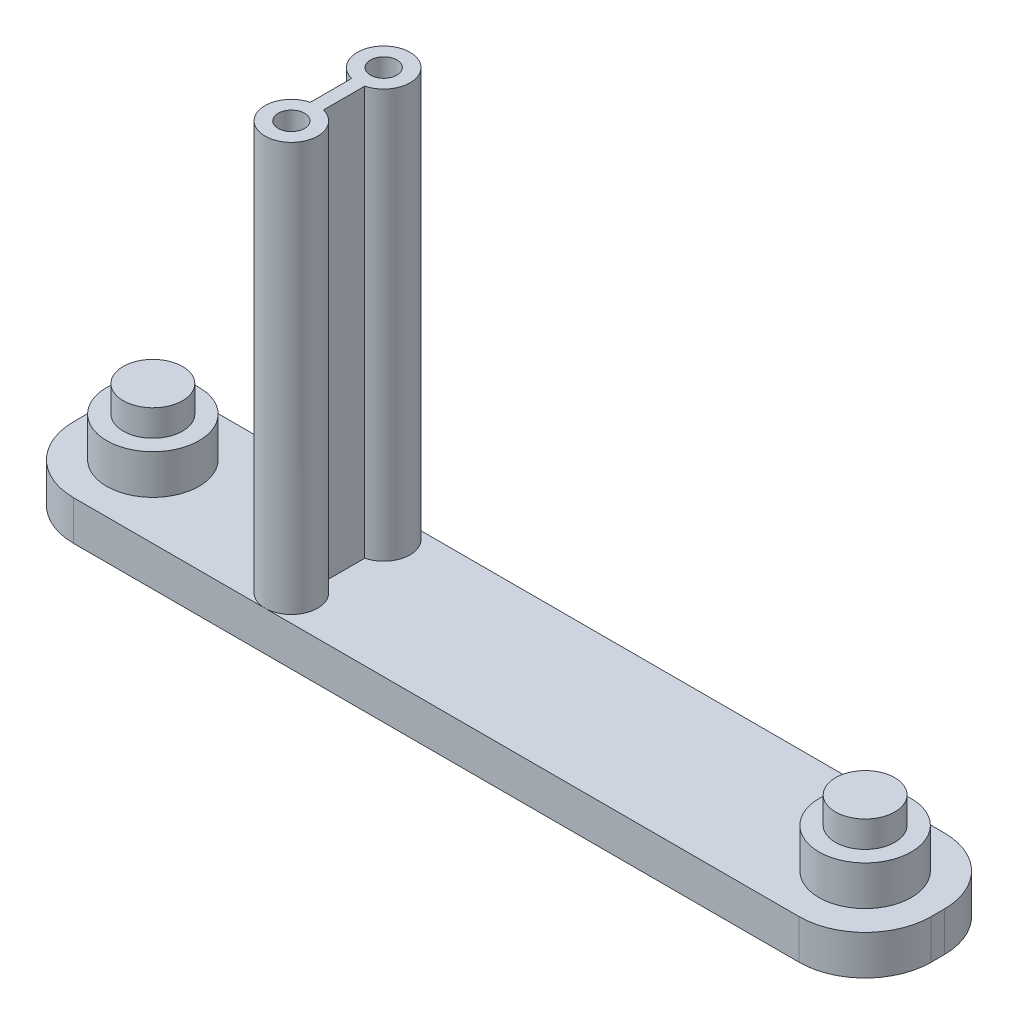
ISO-10303-21;
HEADER;
FILE_DESCRIPTION(('STEP AP214'),'2;1');
FILE_NAME('part.step','',(''),(''),'','','');
FILE_SCHEMA(('AUTOMOTIVE_DESIGN { 1 0 10303 214 1 1 1 1 }'));
ENDSEC;
DATA;
#1=APPLICATION_CONTEXT('core data for automotive mechanical design processes');
#2=APPLICATION_PROTOCOL_DEFINITION('international standard','automotive_design',2000,#1);
#3=PRODUCT_CONTEXT('',#1,'mechanical');
#4=PRODUCT('Part','Part','',(#3));
#5=PRODUCT_RELATED_PRODUCT_CATEGORY('part','',(#4));
#6=PRODUCT_DEFINITION_FORMATION('','',#4);
#7=PRODUCT_DEFINITION_CONTEXT('part definition',#1,'design');
#8=PRODUCT_DEFINITION('design','',#6,#7);
#9=PRODUCT_DEFINITION_SHAPE('','',#8);
#10=(LENGTH_UNIT() NAMED_UNIT(*) SI_UNIT(.MILLI.,.METRE.));
#11=(NAMED_UNIT(*) PLANE_ANGLE_UNIT() SI_UNIT($,.RADIAN.));
#12=(NAMED_UNIT(*) SI_UNIT($,.STERADIAN.) SOLID_ANGLE_UNIT());
#13=UNCERTAINTY_MEASURE_WITH_UNIT(LENGTH_MEASURE(1.E-05),#10,'distance_accuracy_value','');
#14=(GEOMETRIC_REPRESENTATION_CONTEXT(3) GLOBAL_UNCERTAINTY_ASSIGNED_CONTEXT((#13)) GLOBAL_UNIT_ASSIGNED_CONTEXT((#10,
#11,#12)) REPRESENTATION_CONTEXT('',''));
#15=CARTESIAN_POINT('',(0.,0.,0.));
#16=DIRECTION('',(0.,0.,1.));
#17=DIRECTION('',(1.,0.,0.));
#18=AXIS2_PLACEMENT_3D('',#15,#16,#17);
#19=CARTESIAN_POINT('',(0.,0.,0.));
#20=DIRECTION('',(0.,1.,0.));
#21=DIRECTION('',(0.,0.,1.));
#22=AXIS2_PLACEMENT_3D('',#19,#20,#21);
#23=PLANE('',#22);
#24=DIRECTION('',(1.,0.,0.));
#25=VECTOR('',#24,1.);
#26=CARTESIAN_POINT('',(0.,0.,-19.0709184318411));
#27=LINE('',#26,#25);
#28=CARTESIAN_POINT('',(-51.4145331898658,0.,-19.0709184318411));
#29=VERTEX_POINT('',#28);
#30=CARTESIAN_POINT('',(-36.9145331898658,0.,-19.0709184318411));
#31=VERTEX_POINT('',#30);
#32=EDGE_CURVE('E214',#29,#31,#27,.T.);
#33=ORIENTED_EDGE('',*,*,#32,.F.);
#34=CARTESIAN_POINT('',(-51.4145331898658,0.,-14.0709184318411));
#35=DIRECTION('',(0.,1.,0.));
#36=DIRECTION('',(0.,0.,1.));
#37=AXIS2_PLACEMENT_3D('',#34,#35,#36);
#38=CIRCLE('',#37,5.);
#39=CARTESIAN_POINT('',(-56.4145331898658,0.,-14.0709184318411));
#40=VERTEX_POINT('',#39);
#41=EDGE_CURVE('E59',#29,#40,#38,.T.);
#42=ORIENTED_EDGE('',*,*,#41,.T.);
#43=DIRECTION('',(0.,0.,1.));
#44=VECTOR('',#43,1.);
#45=CARTESIAN_POINT('',(-56.4145331898658,0.,0.));
#46=LINE('',#45,#44);
#47=CARTESIAN_POINT('',(-56.4145331898658,0.,-13.0709184318411));
#48=VERTEX_POINT('',#47);
#49=EDGE_CURVE('E198',#40,#48,#46,.T.);
#50=ORIENTED_EDGE('',*,*,#49,.T.);
#51=CARTESIAN_POINT('',(-51.4145331898658,0.,-13.0709184318411));
#52=DIRECTION('',(0.,1.,0.));
#53=DIRECTION('',(0.,0.,1.));
#54=AXIS2_PLACEMENT_3D('',#51,#52,#53);
#55=CIRCLE('',#54,5.);
#56=CARTESIAN_POINT('',(-51.4145331898658,0.,-8.07091843184114));
#57=VERTEX_POINT('',#56);
#58=EDGE_CURVE('E51',#48,#57,#55,.T.);
#59=ORIENTED_EDGE('',*,*,#58,.T.);
#60=DIRECTION('',(1.,0.,0.));
#61=VECTOR('',#60,1.);
#62=CARTESIAN_POINT('',(0.,0.,-8.07091843184114));
#63=LINE('',#62,#61);
#64=CARTESIAN_POINT('',(-36.9145331898658,0.,-8.07091843184114));
#65=VERTEX_POINT('',#64);
#66=EDGE_CURVE('E208',#57,#65,#63,.T.);
#67=ORIENTED_EDGE('',*,*,#66,.T.);
#68=CARTESIAN_POINT('',(-36.9145331898658,0.,-10.0709184318411));
#69=DIRECTION('',(0.,1.,0.));
#70=DIRECTION('',(0.,0.,1.));
#71=AXIS2_PLACEMENT_3D('',#68,#69,#70);
#72=CIRCLE('',#71,2.);
#73=CARTESIAN_POINT('',(-37.4145331898658,0.,-12.0074101049448));
#74=VERTEX_POINT('',#73);
#75=EDGE_CURVE('E161',#65,#74,#72,.F.);
#76=ORIENTED_EDGE('',*,*,#75,.T.);
#77=DIRECTION('',(0.,0.,1.));
#78=VECTOR('',#77,1.);
#79=CARTESIAN_POINT('',(-37.4145331898658,0.,0.));
#80=LINE('',#79,#78);
#81=CARTESIAN_POINT('',(-37.4145331898658,0.,-15.1344267587374));
#82=VERTEX_POINT('',#81);
#83=EDGE_CURVE('E148',#82,#74,#80,.T.);
#84=ORIENTED_EDGE('',*,*,#83,.F.);
#85=CARTESIAN_POINT('',(-36.9145331898658,0.,-17.0709184318411));
#86=DIRECTION('',(0.,1.,0.));
#87=DIRECTION('',(0.,0.,1.));
#88=AXIS2_PLACEMENT_3D('',#85,#86,#87);
#89=CIRCLE('',#88,2.);
#90=EDGE_CURVE('E174',#31,#82,#89,.T.);
#91=ORIENTED_EDGE('',*,*,#90,.F.);
#92=EDGE_LOOP('',(#33,#42,#50,#59,#67,#76,#84,#91));
#93=FACE_BOUND('',#92,.T.);
#94=CARTESIAN_POINT('',(-50.9145331898658,0.,-13.5709184318411));
#95=DIRECTION('',(0.,1.,0.));
#96=DIRECTION('',(0.,0.,1.));
#97=AXIS2_PLACEMENT_3D('',#94,#95,#96);
#98=CIRCLE('',#97,3.5);
#99=CARTESIAN_POINT('',(-50.9145331898658,0.,-10.0709184318411));
#100=VERTEX_POINT('',#99);
#101=EDGE_CURVE('E187',#100,#100,#98,.T.);
#102=ORIENTED_EDGE('',*,*,#101,.F.);
#103=EDGE_LOOP('',(#102));
#104=FACE_BOUND('',#103,.T.);
#105=ADVANCED_FACE('F36',(#93,#104),#23,.T.);
#106=CARTESIAN_POINT('',(0.,3.,0.));
#107=DIRECTION('',(0.,1.,0.));
#108=DIRECTION('',(0.,0.,1.));
#109=AXIS2_PLACEMENT_3D('',#106,#107,#108);
#110=PLANE('',#109);
#111=CARTESIAN_POINT('',(-50.9145331898658,3.,-13.5709184318411));
#112=DIRECTION('',(0.,1.,0.));
#113=DIRECTION('',(0.,0.,1.));
#114=AXIS2_PLACEMENT_3D('',#111,#112,#113);
#115=CIRCLE('',#114,3.5);
#116=CARTESIAN_POINT('',(-50.9145331898658,3.,-10.0709184318411));
#117=VERTEX_POINT('',#116);
#118=EDGE_CURVE('E188',#117,#117,#115,.T.);
#119=ORIENTED_EDGE('',*,*,#118,.T.);
#120=EDGE_LOOP('',(#119));
#121=FACE_BOUND('',#120,.T.);
#122=CARTESIAN_POINT('',(-50.9145331898658,3.,-13.5709184318411));
#123=DIRECTION('',(0.,1.,0.));
#124=DIRECTION('',(0.,0.,1.));
#125=AXIS2_PLACEMENT_3D('',#122,#123,#124);
#126=CIRCLE('',#125,2.25);
#127=CARTESIAN_POINT('',(-50.9145331898658,3.,-11.3209184318411));
#128=VERTEX_POINT('',#127);
#129=EDGE_CURVE('E183',#128,#128,#126,.F.);
#130=ORIENTED_EDGE('',*,*,#129,.T.);
#131=EDGE_LOOP('',(#130));
#132=FACE_BOUND('',#131,.T.);
#133=ADVANCED_FACE('F337',(#121,#132),#110,.T.);
#134=DIRECTION('',(0.,0.,1.));
#135=VECTOR('',#134,1.);
#136=CARTESIAN_POINT('',(8.58546681013422,0.,0.));
#137=LINE('',#136,#135);
#138=CARTESIAN_POINT('',(8.58546681013422,0.,-14.0709184318411));
#139=VERTEX_POINT('',#138);
#140=CARTESIAN_POINT('',(8.58546681013422,0.,-13.0709184318411));
#141=VERTEX_POINT('',#140);
#142=EDGE_CURVE('E210',#139,#141,#137,.T.);
#143=ORIENTED_EDGE('',*,*,#142,.F.);
#144=CARTESIAN_POINT('',(3.58546681013422,0.,-14.0709184318411));
#145=DIRECTION('',(0.,1.,0.));
#146=DIRECTION('',(0.,0.,1.));
#147=AXIS2_PLACEMENT_3D('',#144,#145,#146);
#148=CIRCLE('',#147,5.);
#149=CARTESIAN_POINT('',(3.58546681013422,0.,-19.0709184318411));
#150=VERTEX_POINT('',#149);
#151=EDGE_CURVE('E231',#139,#150,#148,.T.);
#152=ORIENTED_EDGE('',*,*,#151,.T.);
#153=EDGE_CURVE('E213',#31,#150,#27,.T.);
#154=ORIENTED_EDGE('',*,*,#153,.F.);
#155=CARTESIAN_POINT('',(-36.4145331898658,0.,-15.1344267587374));
#156=VERTEX_POINT('',#155);
#157=EDGE_CURVE('E168',#156,#31,#89,.T.);
#158=ORIENTED_EDGE('',*,*,#157,.F.);
#159=DIRECTION('',(0.,0.,1.));
#160=VECTOR('',#159,1.);
#161=CARTESIAN_POINT('',(-36.4145331898658,0.,0.));
#162=LINE('',#161,#160);
#163=CARTESIAN_POINT('',(-36.4145331898658,0.,-12.0074101049448));
#164=VERTEX_POINT('',#163);
#165=EDGE_CURVE('E142',#156,#164,#162,.T.);
#166=ORIENTED_EDGE('',*,*,#165,.T.);
#167=EDGE_CURVE('E158',#164,#65,#72,.F.);
#168=ORIENTED_EDGE('',*,*,#167,.T.);
#169=CARTESIAN_POINT('',(3.58546681013422,0.,-8.07091843184114));
#170=VERTEX_POINT('',#169);
#171=EDGE_CURVE('E191',#65,#170,#63,.T.);
#172=ORIENTED_EDGE('',*,*,#171,.T.);
#173=CARTESIAN_POINT('',(3.58546681013422,0.,-13.0709184318411));
#174=DIRECTION('',(0.,1.,0.));
#175=DIRECTION('',(0.,0.,1.));
#176=AXIS2_PLACEMENT_3D('',#173,#174,#175);
#177=CIRCLE('',#176,5.);
#178=EDGE_CURVE('E229',#170,#141,#177,.T.);
#179=ORIENTED_EDGE('',*,*,#178,.T.);
#180=EDGE_LOOP('',(#143,#152,#154,#158,#166,#168,#172,#179));
#181=FACE_BOUND('',#180,.T.);
#182=CARTESIAN_POINT('',(3.08546681013422,0.,-13.5709184318411));
#183=DIRECTION('',(0.,1.,0.));
#184=DIRECTION('',(0.,0.,1.));
#185=AXIS2_PLACEMENT_3D('',#182,#183,#184);
#186=CIRCLE('',#185,3.5);
#187=CARTESIAN_POINT('',(3.08546681013422,0.,-10.0709184318411));
#188=VERTEX_POINT('',#187);
#189=EDGE_CURVE('E207',#188,#188,#186,.T.);
#190=ORIENTED_EDGE('',*,*,#189,.F.);
#191=EDGE_LOOP('',(#190));
#192=FACE_BOUND('',#191,.T.);
#193=ADVANCED_FACE('F274',(#181,#192),#23,.T.);
#194=CARTESIAN_POINT('',(0.,-3.,-8.07091843184114));
#195=DIRECTION('',(0.,0.,1.));
#196=DIRECTION('',(1.,0.,0.));
#197=AXIS2_PLACEMENT_3D('',#194,#195,#196);
#198=PLANE('',#197);
#199=DIRECTION('',(1.,0.,0.));
#200=VECTOR('',#199,1.);
#201=CARTESIAN_POINT('',(0.,-3.,-8.07091843184114));
#202=LINE('',#201,#200);
#203=CARTESIAN_POINT('',(-51.4145331898658,-3.,-8.07091843184114));
#204=VERTEX_POINT('',#203);
#205=CARTESIAN_POINT('',(3.58546681013422,-3.,-8.07091843184114));
#206=VERTEX_POINT('',#205);
#207=EDGE_CURVE('E194',#204,#206,#202,.T.);
#208=ORIENTED_EDGE('',*,*,#207,.T.);
#209=DIRECTION('',(0.,1.,0.));
#210=VECTOR('',#209,1.);
#211=CARTESIAN_POINT('',(3.58546681013422,0.,-8.07091843184114));
#212=LINE('',#211,#210);
#213=EDGE_CURVE('E248',#206,#170,#212,.T.);
#214=ORIENTED_EDGE('',*,*,#213,.T.);
#215=ORIENTED_EDGE('',*,*,#171,.F.);
#216=ORIENTED_EDGE('',*,*,#66,.F.);
#217=DIRECTION('',(0.,1.,0.));
#218=VECTOR('',#217,1.);
#219=CARTESIAN_POINT('',(-51.4145331898658,-3.,-8.07091843184114));
#220=LINE('',#219,#218);
#221=EDGE_CURVE('E246',#57,#204,#220,.F.);
#222=ORIENTED_EDGE('',*,*,#221,.T.);
#223=EDGE_LOOP('',(#208,#214,#215,#216,#222));
#224=FACE_BOUND('',#223,.T.);
#225=ADVANCED_FACE('F261',(#224),#198,.T.);
#226=CARTESIAN_POINT('',(-56.4145331898658,-3.,0.));
#227=DIRECTION('',(-1.,0.,0.));
#228=DIRECTION('',(0.,0.,1.));
#229=AXIS2_PLACEMENT_3D('',#226,#227,#228);
#230=PLANE('',#229);
#231=ORIENTED_EDGE('',*,*,#49,.F.);
#232=DIRECTION('',(0.,1.,0.));
#233=VECTOR('',#232,1.);
#234=CARTESIAN_POINT('',(-56.4145331898658,-3.,-14.0709184318411));
#235=LINE('',#234,#233);
#236=CARTESIAN_POINT('',(-56.4145331898658,-3.,-14.0709184318411));
#237=VERTEX_POINT('',#236);
#238=EDGE_CURVE('E12',#40,#237,#235,.F.);
#239=ORIENTED_EDGE('',*,*,#238,.T.);
#240=DIRECTION('',(0.,0.,1.));
#241=VECTOR('',#240,1.);
#242=CARTESIAN_POINT('',(-56.4145331898658,-3.,0.));
#243=LINE('',#242,#241);
#244=CARTESIAN_POINT('',(-56.4145331898658,-3.,-13.0709184318411));
#245=VERTEX_POINT('',#244);
#246=EDGE_CURVE('E204',#237,#245,#243,.T.);
#247=ORIENTED_EDGE('',*,*,#246,.T.);
#248=DIRECTION('',(0.,1.,0.));
#249=VECTOR('',#248,1.);
#250=CARTESIAN_POINT('',(-56.4145331898658,-3.,-13.0709184318411));
#251=LINE('',#250,#249);
#252=EDGE_CURVE('E44',#245,#48,#251,.T.);
#253=ORIENTED_EDGE('',*,*,#252,.T.);
#254=EDGE_LOOP('',(#231,#239,#247,#253));
#255=FACE_BOUND('',#254,.T.);
#256=ADVANCED_FACE('F253',(#255),#230,.T.);
#257=CARTESIAN_POINT('',(0.,-3.,-19.0709184318411));
#258=DIRECTION('',(0.,0.,1.));
#259=DIRECTION('',(1.,0.,0.));
#260=AXIS2_PLACEMENT_3D('',#257,#258,#259);
#261=PLANE('',#260);
#262=ORIENTED_EDGE('',*,*,#153,.T.);
#263=DIRECTION('',(0.,1.,0.));
#264=VECTOR('',#263,1.);
#265=CARTESIAN_POINT('',(3.58546681013422,-3.,-19.0709184318411));
#266=LINE('',#265,#264);
#267=CARTESIAN_POINT('',(3.58546681013422,-3.,-19.0709184318411));
#268=VERTEX_POINT('',#267);
#269=EDGE_CURVE('E236',#150,#268,#266,.F.);
#270=ORIENTED_EDGE('',*,*,#269,.T.);
#271=DIRECTION('',(1.,0.,0.));
#272=VECTOR('',#271,1.);
#273=CARTESIAN_POINT('',(0.,-3.,-19.0709184318411));
#274=LINE('',#273,#272);
#275=CARTESIAN_POINT('',(-51.4145331898658,-3.,-19.0709184318411));
#276=VERTEX_POINT('',#275);
#277=EDGE_CURVE('E201',#276,#268,#274,.T.);
#278=ORIENTED_EDGE('',*,*,#277,.F.);
#279=DIRECTION('',(0.,1.,0.));
#280=VECTOR('',#279,1.);
#281=CARTESIAN_POINT('',(-51.4145331898658,0.,-19.0709184318411));
#282=LINE('',#281,#280);
#283=EDGE_CURVE('E233',#276,#29,#282,.T.);
#284=ORIENTED_EDGE('',*,*,#283,.T.);
#285=ORIENTED_EDGE('',*,*,#32,.T.);
#286=EDGE_LOOP('',(#262,#270,#278,#284,#285));
#287=FACE_BOUND('',#286,.T.);
#288=ADVANCED_FACE('F288',(#287),#261,.F.);
#289=CARTESIAN_POINT('',(8.58546681013422,-3.,0.));
#290=DIRECTION('',(-1.,0.,0.));
#291=DIRECTION('',(0.,0.,1.));
#292=AXIS2_PLACEMENT_3D('',#289,#290,#291);
#293=PLANE('',#292);
#294=DIRECTION('',(0.,0.,1.));
#295=VECTOR('',#294,1.);
#296=CARTESIAN_POINT('',(8.58546681013422,-3.,0.));
#297=LINE('',#296,#295);
#298=CARTESIAN_POINT('',(8.58546681013422,-3.,-14.0709184318411));
#299=VERTEX_POINT('',#298);
#300=CARTESIAN_POINT('',(8.58546681013422,-3.,-13.0709184318411));
#301=VERTEX_POINT('',#300);
#302=EDGE_CURVE('E197',#299,#301,#297,.T.);
#303=ORIENTED_EDGE('',*,*,#302,.F.);
#304=DIRECTION('',(0.,1.,0.));
#305=VECTOR('',#304,1.);
#306=CARTESIAN_POINT('',(8.58546681013422,-3.,-14.0709184318411));
#307=LINE('',#306,#305);
#308=EDGE_CURVE('E226',#299,#139,#307,.T.);
#309=ORIENTED_EDGE('',*,*,#308,.T.);
#310=ORIENTED_EDGE('',*,*,#142,.T.);
#311=DIRECTION('',(0.,1.,0.));
#312=VECTOR('',#311,1.);
#313=CARTESIAN_POINT('',(8.58546681013422,-3.,-13.0709184318411));
#314=LINE('',#313,#312);
#315=EDGE_CURVE('E224',#141,#301,#314,.F.);
#316=ORIENTED_EDGE('',*,*,#315,.T.);
#317=EDGE_LOOP('',(#303,#309,#310,#316));
#318=FACE_BOUND('',#317,.T.);
#319=ADVANCED_FACE('F278',(#318),#293,.F.);
#320=CARTESIAN_POINT('',(0.,-3.,0.));
#321=DIRECTION('',(0.,1.,0.));
#322=DIRECTION('',(0.,0.,1.));
#323=AXIS2_PLACEMENT_3D('',#320,#321,#322);
#324=PLANE('',#323);
#325=ORIENTED_EDGE('',*,*,#277,.T.);
#326=CARTESIAN_POINT('',(3.58546681013422,-3.,-14.0709184318411));
#327=DIRECTION('',(0.,1.,0.));
#328=DIRECTION('',(0.,0.,1.));
#329=AXIS2_PLACEMENT_3D('',#326,#327,#328);
#330=CIRCLE('',#329,5.);
#331=EDGE_CURVE('E244',#268,#299,#330,.F.);
#332=ORIENTED_EDGE('',*,*,#331,.T.);
#333=ORIENTED_EDGE('',*,*,#302,.T.);
#334=CARTESIAN_POINT('',(3.58546681013422,-3.,-13.0709184318411));
#335=DIRECTION('',(0.,1.,0.));
#336=DIRECTION('',(0.,0.,1.));
#337=AXIS2_PLACEMENT_3D('',#334,#335,#336);
#338=CIRCLE('',#337,5.);
#339=EDGE_CURVE('E242',#301,#206,#338,.F.);
#340=ORIENTED_EDGE('',*,*,#339,.T.);
#341=ORIENTED_EDGE('',*,*,#207,.F.);
#342=CARTESIAN_POINT('',(-51.4145331898658,-3.,-13.0709184318411));
#343=DIRECTION('',(0.,1.,0.));
#344=DIRECTION('',(0.,0.,1.));
#345=AXIS2_PLACEMENT_3D('',#342,#343,#344);
#346=CIRCLE('',#345,5.);
#347=EDGE_CURVE('E238',#204,#245,#346,.F.);
#348=ORIENTED_EDGE('',*,*,#347,.T.);
#349=ORIENTED_EDGE('',*,*,#246,.F.);
#350=CARTESIAN_POINT('',(-51.4145331898658,-3.,-14.0709184318411));
#351=DIRECTION('',(0.,1.,0.));
#352=DIRECTION('',(0.,0.,1.));
#353=AXIS2_PLACEMENT_3D('',#350,#351,#352);
#354=CIRCLE('',#353,5.);
#355=EDGE_CURVE('E240',#237,#276,#354,.F.);
#356=ORIENTED_EDGE('',*,*,#355,.T.);
#357=EDGE_LOOP('',(#325,#332,#333,#340,#341,#348,#349,#356));
#358=FACE_BOUND('',#357,.T.);
#359=ADVANCED_FACE('F265',(#358),#324,.F.);
#360=CARTESIAN_POINT('',(-50.9145331898658,3.,-13.5709184318411));
#361=DIRECTION('',(0.,-1.,0.));
#362=DIRECTION('',(0.,0.,-1.));
#363=AXIS2_PLACEMENT_3D('',#360,#361,#362);
#364=CYLINDRICAL_SURFACE('',#363,3.5);
#365=ORIENTED_EDGE('',*,*,#118,.F.);
#366=EDGE_LOOP('',(#365));
#367=FACE_BOUND('',#366,.T.);
#368=ORIENTED_EDGE('',*,*,#101,.T.);
#369=EDGE_LOOP('',(#368));
#370=FACE_BOUND('',#369,.T.);
#371=ADVANCED_FACE('F452',(#367,#370),#364,.T.);
#372=CARTESIAN_POINT('',(3.08546681013422,3.,-13.5709184318411));
#373=DIRECTION('',(0.,-1.,0.));
#374=DIRECTION('',(0.,0.,-1.));
#375=AXIS2_PLACEMENT_3D('',#372,#373,#374);
#376=CYLINDRICAL_SURFACE('',#375,3.5);
#377=CARTESIAN_POINT('',(3.08546681013422,3.,-13.5709184318411));
#378=DIRECTION('',(0.,1.,0.));
#379=DIRECTION('',(0.,0.,1.));
#380=AXIS2_PLACEMENT_3D('',#377,#378,#379);
#381=CIRCLE('',#380,3.5);
#382=CARTESIAN_POINT('',(3.08546681013422,3.,-10.0709184318411));
#383=VERTEX_POINT('',#382);
#384=EDGE_CURVE('E184',#383,#383,#381,.F.);
#385=ORIENTED_EDGE('',*,*,#384,.T.);
#386=EDGE_LOOP('',(#385));
#387=FACE_BOUND('',#386,.T.);
#388=ORIENTED_EDGE('',*,*,#189,.T.);
#389=EDGE_LOOP('',(#388));
#390=FACE_BOUND('',#389,.T.);
#391=ADVANCED_FACE('F538',(#387,#390),#376,.T.);
#392=CARTESIAN_POINT('',(0.,3.,0.));
#393=DIRECTION('',(0.,1.,0.));
#394=DIRECTION('',(0.,0.,1.));
#395=AXIS2_PLACEMENT_3D('',#392,#393,#394);
#396=PLANE('',#395);
#397=CARTESIAN_POINT('',(3.08546681013422,3.,-13.5709184318411));
#398=DIRECTION('',(0.,1.,0.));
#399=DIRECTION('',(0.,0.,1.));
#400=AXIS2_PLACEMENT_3D('',#397,#398,#399);
#401=CIRCLE('',#400,2.25);
#402=CARTESIAN_POINT('',(3.08546681013422,3.,-11.3209184318411));
#403=VERTEX_POINT('',#402);
#404=EDGE_CURVE('E219',#403,#403,#401,.T.);
#405=ORIENTED_EDGE('',*,*,#404,.F.);
#406=EDGE_LOOP('',(#405));
#407=FACE_BOUND('',#406,.T.);
#408=ORIENTED_EDGE('',*,*,#384,.F.);
#409=EDGE_LOOP('',(#408));
#410=FACE_BOUND('',#409,.T.);
#411=ADVANCED_FACE('F523',(#407,#410),#396,.T.);
#412=CARTESIAN_POINT('',(-50.9145331898658,13.3639610306789,-13.5709184318411));
#413=DIRECTION('',(0.,-1.,0.));
#414=DIRECTION('',(0.,0.,-1.));
#415=AXIS2_PLACEMENT_3D('',#412,#413,#414);
#416=CYLINDRICAL_SURFACE('',#415,2.25);
#417=ORIENTED_EDGE('',*,*,#129,.F.);
#418=EDGE_LOOP('',(#417));
#419=FACE_BOUND('',#418,.T.);
#420=CARTESIAN_POINT('',(-50.9145331898658,5.,-13.5709184318411));
#421=DIRECTION('',(0.,1.,0.));
#422=DIRECTION('',(0.,0.,1.));
#423=AXIS2_PLACEMENT_3D('',#420,#421,#422);
#424=CIRCLE('',#423,2.25);
#425=CARTESIAN_POINT('',(-50.9145331898658,5.,-11.3209184318411));
#426=VERTEX_POINT('',#425);
#427=EDGE_CURVE('E180',#426,#426,#424,.T.);
#428=ORIENTED_EDGE('',*,*,#427,.F.);
#429=EDGE_LOOP('',(#428));
#430=FACE_BOUND('',#429,.T.);
#431=ADVANCED_FACE('F514',(#419,#430),#416,.T.);
#432=CARTESIAN_POINT('',(0.,5.,0.));
#433=DIRECTION('',(0.,1.,0.));
#434=DIRECTION('',(0.,0.,1.));
#435=AXIS2_PLACEMENT_3D('',#432,#433,#434);
#436=PLANE('',#435);
#437=ORIENTED_EDGE('',*,*,#427,.T.);
#438=EDGE_LOOP('',(#437));
#439=FACE_BOUND('',#438,.T.);
#440=ADVANCED_FACE('F505',(#439),#436,.T.);
#441=CARTESIAN_POINT('',(0.,5.,0.));
#442=DIRECTION('',(0.,1.,0.));
#443=DIRECTION('',(0.,0.,1.));
#444=AXIS2_PLACEMENT_3D('',#441,#442,#443);
#445=PLANE('',#444);
#446=CARTESIAN_POINT('',(3.08546681013422,5.,-13.5709184318411));
#447=DIRECTION('',(0.,1.,0.));
#448=DIRECTION('',(0.,0.,1.));
#449=AXIS2_PLACEMENT_3D('',#446,#447,#448);
#450=CIRCLE('',#449,2.25);
#451=CARTESIAN_POINT('',(3.08546681013422,5.,-11.3209184318411));
#452=VERTEX_POINT('',#451);
#453=EDGE_CURVE('E177',#452,#452,#450,.F.);
#454=ORIENTED_EDGE('',*,*,#453,.F.);
#455=EDGE_LOOP('',(#454));
#456=FACE_BOUND('',#455,.T.);
#457=ADVANCED_FACE('F497',(#456),#445,.T.);
#458=CARTESIAN_POINT('',(3.08546681013422,13.3639610306789,-13.5709184318411));
#459=DIRECTION('',(0.,-1.,0.));
#460=DIRECTION('',(0.,0.,-1.));
#461=AXIS2_PLACEMENT_3D('',#458,#459,#460);
#462=CYLINDRICAL_SURFACE('',#461,2.25);
#463=ORIENTED_EDGE('',*,*,#404,.T.);
#464=EDGE_LOOP('',(#463));
#465=FACE_BOUND('',#464,.T.);
#466=ORIENTED_EDGE('',*,*,#453,.T.);
#467=EDGE_LOOP('',(#466));
#468=FACE_BOUND('',#467,.T.);
#469=ADVANCED_FACE('F319',(#465,#468),#462,.T.);
#470=CARTESIAN_POINT('',(0.,31.,0.));
#471=DIRECTION('',(0.,1.,0.));
#472=DIRECTION('',(0.,0.,1.));
#473=AXIS2_PLACEMENT_3D('',#470,#471,#472);
#474=PLANE('',#473);
#475=CARTESIAN_POINT('',(-36.9145331898658,31.,-17.0709184318411));
#476=DIRECTION('',(0.,1.,0.));
#477=DIRECTION('',(0.,0.,1.));
#478=AXIS2_PLACEMENT_3D('',#475,#476,#477);
#479=CIRCLE('',#478,0.999999999999998);
#480=CARTESIAN_POINT('',(-36.9145331898658,31.,-16.0709184318411));
#481=VERTEX_POINT('',#480);
#482=EDGE_CURVE('E302',#481,#481,#479,.T.);
#483=ORIENTED_EDGE('',*,*,#482,.F.);
#484=EDGE_LOOP('',(#483));
#485=FACE_BOUND('',#484,.T.);
#486=CARTESIAN_POINT('',(-36.9145331898658,31.,-10.0709184318411));
#487=DIRECTION('',(0.,1.,0.));
#488=DIRECTION('',(0.,0.,1.));
#489=AXIS2_PLACEMENT_3D('',#486,#487,#488);
#490=CIRCLE('',#489,0.999999999999998);
#491=CARTESIAN_POINT('',(-36.9145331898658,31.,-9.07091843184114));
#492=VERTEX_POINT('',#491);
#493=EDGE_CURVE('E296',#492,#492,#490,.T.);
#494=ORIENTED_EDGE('',*,*,#493,.F.);
#495=EDGE_LOOP('',(#494));
#496=FACE_BOUND('',#495,.T.);
#497=DIRECTION('',(0.,0.,1.));
#498=VECTOR('',#497,1.);
#499=CARTESIAN_POINT('',(-36.4145331898658,31.,0.));
#500=LINE('',#499,#498);
#501=CARTESIAN_POINT('',(-36.4145331898658,31.,-15.1344267587374));
#502=VERTEX_POINT('',#501);
#503=CARTESIAN_POINT('',(-36.4145331898658,31.,-12.0074101049448));
#504=VERTEX_POINT('',#503);
#505=EDGE_CURVE('E166',#502,#504,#500,.T.);
#506=ORIENTED_EDGE('',*,*,#505,.F.);
#507=CARTESIAN_POINT('',(-36.9145331898658,31.,-17.0709184318411));
#508=DIRECTION('',(0.,1.,0.));
#509=DIRECTION('',(0.,0.,1.));
#510=AXIS2_PLACEMENT_3D('',#507,#508,#509);
#511=CIRCLE('',#510,2.);
#512=CARTESIAN_POINT('',(-37.4145331898658,31.,-15.1344267587374));
#513=VERTEX_POINT('',#512);
#514=EDGE_CURVE('E138',#502,#513,#511,.T.);
#515=ORIENTED_EDGE('',*,*,#514,.T.);
#516=DIRECTION('',(0.,0.,1.));
#517=VECTOR('',#516,1.);
#518=CARTESIAN_POINT('',(-37.4145331898658,31.,0.));
#519=LINE('',#518,#517);
#520=CARTESIAN_POINT('',(-37.4145331898658,31.,-12.0074101049449));
#521=VERTEX_POINT('',#520);
#522=EDGE_CURVE('E131',#513,#521,#519,.T.);
#523=ORIENTED_EDGE('',*,*,#522,.T.);
#524=CARTESIAN_POINT('',(-36.9145331898658,31.,-10.0709184318411));
#525=DIRECTION('',(0.,1.,0.));
#526=DIRECTION('',(0.,0.,1.));
#527=AXIS2_PLACEMENT_3D('',#524,#525,#526);
#528=CIRCLE('',#527,2.);
#529=EDGE_CURVE('E135',#504,#521,#528,.F.);
#530=ORIENTED_EDGE('',*,*,#529,.F.);
#531=EDGE_LOOP('',(#506,#515,#523,#530));
#532=FACE_BOUND('',#531,.T.);
#533=ADVANCED_FACE('F133',(#485,#496,#532),#474,.T.);
#534=CARTESIAN_POINT('',(-36.9145331898658,73.7046999107196,-10.0709184318411));
#535=DIRECTION('',(0.,-1.,0.));
#536=DIRECTION('',(0.,0.,-1.));
#537=AXIS2_PLACEMENT_3D('',#534,#535,#536);
#538=CYLINDRICAL_SURFACE('',#537,2.);
#539=DIRECTION('',(0.,-1.,0.));
#540=VECTOR('',#539,1.);
#541=CARTESIAN_POINT('',(-36.4145331898658,73.7046999107196,-12.0074101049448));
#542=LINE('',#541,#540);
#543=EDGE_CURVE('E157',#504,#164,#542,.T.);
#544=ORIENTED_EDGE('',*,*,#543,.F.);
#545=ORIENTED_EDGE('',*,*,#529,.T.);
#546=DIRECTION('',(0.,-1.,0.));
#547=VECTOR('',#546,1.);
#548=CARTESIAN_POINT('',(-37.4145331898658,73.7046999107196,-12.0074101049449));
#549=LINE('',#548,#547);
#550=EDGE_CURVE('E146',#521,#74,#549,.T.);
#551=ORIENTED_EDGE('',*,*,#550,.T.);
#552=ORIENTED_EDGE('',*,*,#75,.F.);
#553=ORIENTED_EDGE('',*,*,#167,.F.);
#554=EDGE_LOOP('',(#544,#545,#551,#552,#553));
#555=FACE_BOUND('',#554,.T.);
#556=ADVANCED_FACE('F154',(#555),#538,.T.);
#557=CARTESIAN_POINT('',(-37.4145331898658,73.7046999107196,0.));
#558=DIRECTION('',(1.,0.,0.));
#559=DIRECTION('',(0.,0.,-1.));
#560=AXIS2_PLACEMENT_3D('',#557,#558,#559);
#561=PLANE('',#560);
#562=ORIENTED_EDGE('',*,*,#522,.F.);
#563=DIRECTION('',(0.,-1.,0.));
#564=VECTOR('',#563,1.);
#565=CARTESIAN_POINT('',(-37.4145331898658,73.7046999107196,-15.1344267587374));
#566=LINE('',#565,#564);
#567=EDGE_CURVE('E151',#513,#82,#566,.T.);
#568=ORIENTED_EDGE('',*,*,#567,.T.);
#569=ORIENTED_EDGE('',*,*,#83,.T.);
#570=ORIENTED_EDGE('',*,*,#550,.F.);
#571=EDGE_LOOP('',(#562,#568,#569,#570));
#572=FACE_BOUND('',#571,.T.);
#573=ADVANCED_FACE('F147',(#572),#561,.F.);
#574=CARTESIAN_POINT('',(-36.9145331898658,73.7046999107196,-17.0709184318411));
#575=DIRECTION('',(0.,-1.,0.));
#576=DIRECTION('',(0.,0.,-1.));
#577=AXIS2_PLACEMENT_3D('',#574,#575,#576);
#578=CYLINDRICAL_SURFACE('',#577,2.);
#579=ORIENTED_EDGE('',*,*,#514,.F.);
#580=DIRECTION('',(0.,-1.,0.));
#581=VECTOR('',#580,1.);
#582=CARTESIAN_POINT('',(-36.4145331898658,73.7046999107196,-15.1344267587374));
#583=LINE('',#582,#581);
#584=EDGE_CURVE('E171',#502,#156,#583,.T.);
#585=ORIENTED_EDGE('',*,*,#584,.T.);
#586=ORIENTED_EDGE('',*,*,#157,.T.);
#587=ORIENTED_EDGE('',*,*,#90,.T.);
#588=ORIENTED_EDGE('',*,*,#567,.F.);
#589=EDGE_LOOP('',(#579,#585,#586,#587,#588));
#590=FACE_BOUND('',#589,.T.);
#591=ADVANCED_FACE('F420',(#590),#578,.T.);
#592=CARTESIAN_POINT('',(-36.4145331898658,73.7046999107196,0.));
#593=DIRECTION('',(1.,0.,0.));
#594=DIRECTION('',(0.,0.,-1.));
#595=AXIS2_PLACEMENT_3D('',#592,#593,#594);
#596=PLANE('',#595);
#597=ORIENTED_EDGE('',*,*,#584,.F.);
#598=ORIENTED_EDGE('',*,*,#505,.T.);
#599=ORIENTED_EDGE('',*,*,#543,.T.);
#600=ORIENTED_EDGE('',*,*,#165,.F.);
#601=EDGE_LOOP('',(#597,#598,#599,#600));
#602=FACE_BOUND('',#601,.T.);
#603=ADVANCED_FACE('F359',(#602),#596,.T.);
#604=CARTESIAN_POINT('',(3.58546681013422,-3.,-14.0709184318411));
#605=DIRECTION('',(0.,1.,0.));
#606=DIRECTION('',(0.,0.,1.));
#607=AXIS2_PLACEMENT_3D('',#604,#605,#606);
#608=CYLINDRICAL_SURFACE('',#607,5.);
#609=ORIENTED_EDGE('',*,*,#331,.F.);
#610=ORIENTED_EDGE('',*,*,#269,.F.);
#611=ORIENTED_EDGE('',*,*,#151,.F.);
#612=ORIENTED_EDGE('',*,*,#308,.F.);
#613=EDGE_LOOP('',(#609,#610,#611,#612));
#614=FACE_BOUND('',#613,.T.);
#615=ADVANCED_FACE('F282',(#614),#608,.T.);
#616=CARTESIAN_POINT('',(3.58546681013422,-3.,-13.0709184318411));
#617=DIRECTION('',(0.,-1.,0.));
#618=DIRECTION('',(0.,0.,-1.));
#619=AXIS2_PLACEMENT_3D('',#616,#617,#618);
#620=CYLINDRICAL_SURFACE('',#619,5.);
#621=ORIENTED_EDGE('',*,*,#339,.F.);
#622=ORIENTED_EDGE('',*,*,#315,.F.);
#623=ORIENTED_EDGE('',*,*,#178,.F.);
#624=ORIENTED_EDGE('',*,*,#213,.F.);
#625=EDGE_LOOP('',(#621,#622,#623,#624));
#626=FACE_BOUND('',#625,.T.);
#627=ADVANCED_FACE('F270',(#626),#620,.T.);
#628=CARTESIAN_POINT('',(-51.4145331898658,-3.,-14.0709184318411));
#629=DIRECTION('',(0.,-1.,0.));
#630=DIRECTION('',(0.,0.,-1.));
#631=AXIS2_PLACEMENT_3D('',#628,#629,#630);
#632=CYLINDRICAL_SURFACE('',#631,5.);
#633=ORIENTED_EDGE('',*,*,#355,.F.);
#634=ORIENTED_EDGE('',*,*,#238,.F.);
#635=ORIENTED_EDGE('',*,*,#41,.F.);
#636=ORIENTED_EDGE('',*,*,#283,.F.);
#637=EDGE_LOOP('',(#633,#634,#635,#636));
#638=FACE_BOUND('',#637,.T.);
#639=ADVANCED_FACE('F333',(#638),#632,.T.);
#640=CARTESIAN_POINT('',(-51.4145331898658,-3.,-13.0709184318411));
#641=DIRECTION('',(0.,1.,0.));
#642=DIRECTION('',(0.,0.,1.));
#643=AXIS2_PLACEMENT_3D('',#640,#641,#642);
#644=CYLINDRICAL_SURFACE('',#643,5.);
#645=ORIENTED_EDGE('',*,*,#347,.F.);
#646=ORIENTED_EDGE('',*,*,#221,.F.);
#647=ORIENTED_EDGE('',*,*,#58,.F.);
#648=ORIENTED_EDGE('',*,*,#252,.F.);
#649=EDGE_LOOP('',(#645,#646,#647,#648));
#650=FACE_BOUND('',#649,.T.);
#651=ADVANCED_FACE('F38',(#650),#644,.T.);
#652=CARTESIAN_POINT('',(-36.9145331898658,21.,-10.0709184318411));
#653=DIRECTION('',(0.,1.,0.));
#654=DIRECTION('',(0.,0.,1.));
#655=AXIS2_PLACEMENT_3D('',#652,#653,#654);
#656=CYLINDRICAL_SURFACE('',#655,0.999999999999998);
#657=CARTESIAN_POINT('',(-36.9145331898658,21.,-10.0709184318411));
#658=DIRECTION('',(0.,1.,0.));
#659=DIRECTION('',(0.,0.,1.));
#660=AXIS2_PLACEMENT_3D('',#657,#658,#659);
#661=CIRCLE('',#660,0.999999999999998);
#662=CARTESIAN_POINT('',(-36.9145331898658,21.,-9.07091843184114));
#663=VERTEX_POINT('',#662);
#664=EDGE_CURVE('E169',#663,#663,#661,.T.);
#665=ORIENTED_EDGE('',*,*,#664,.F.);
#666=EDGE_LOOP('',(#665));
#667=FACE_BOUND('',#666,.T.);
#668=ORIENTED_EDGE('',*,*,#493,.T.);
#669=EDGE_LOOP('',(#668));
#670=FACE_BOUND('',#669,.T.);
#671=ADVANCED_FACE('F323',(#667,#670),#656,.F.);
#672=CARTESIAN_POINT('',(-36.9145331898658,21.,-10.0709184318411));
#673=DIRECTION('',(0.,1.,0.));
#674=DIRECTION('',(0.,0.,1.));
#675=AXIS2_PLACEMENT_3D('',#672,#673,#674);
#676=PLANE('',#675);
#677=ORIENTED_EDGE('',*,*,#664,.T.);
#678=EDGE_LOOP('',(#677));
#679=FACE_BOUND('',#678,.T.);
#680=ADVANCED_FACE('F313',(#679),#676,.T.);
#681=CARTESIAN_POINT('',(-36.9145331898658,21.,-17.0709184318411));
#682=DIRECTION('',(0.,1.,0.));
#683=DIRECTION('',(0.,0.,1.));
#684=AXIS2_PLACEMENT_3D('',#681,#682,#683);
#685=CYLINDRICAL_SURFACE('',#684,0.999999999999998);
#686=CARTESIAN_POINT('',(-36.9145331898658,21.,-17.0709184318411));
#687=DIRECTION('',(0.,1.,0.));
#688=DIRECTION('',(0.,0.,1.));
#689=AXIS2_PLACEMENT_3D('',#686,#687,#688);
#690=CIRCLE('',#689,0.999999999999998);
#691=CARTESIAN_POINT('',(-36.9145331898658,21.,-16.0709184318411));
#692=VERTEX_POINT('',#691);
#693=EDGE_CURVE('E299',#692,#692,#690,.T.);
#694=ORIENTED_EDGE('',*,*,#693,.F.);
#695=EDGE_LOOP('',(#694));
#696=FACE_BOUND('',#695,.T.);
#697=ORIENTED_EDGE('',*,*,#482,.T.);
#698=EDGE_LOOP('',(#697));
#699=FACE_BOUND('',#698,.T.);
#700=ADVANCED_FACE('F310',(#696,#699),#685,.F.);
#701=CARTESIAN_POINT('',(-36.9145331898658,21.,-17.0709184318411));
#702=DIRECTION('',(0.,1.,0.));
#703=DIRECTION('',(0.,0.,1.));
#704=AXIS2_PLACEMENT_3D('',#701,#702,#703);
#705=PLANE('',#704);
#706=ORIENTED_EDGE('',*,*,#693,.T.);
#707=EDGE_LOOP('',(#706));
#708=FACE_BOUND('',#707,.T.);
#709=ADVANCED_FACE('F308',(#708),#705,.T.);
#710=CLOSED_SHELL('',(#105,#133,#193,#225,#256,#288,#319,#359,#371,#391,#411,#431,#440,#457,
#469,#533,#556,#573,#591,#603,#615,#627,#639,#651,#671,#680,#700,#709));
#711=MANIFOLD_SOLID_BREP('B2',#710);
#712=ADVANCED_BREP_SHAPE_REPRESENTATION('',(#18,#711),#14);
#713=SHAPE_DEFINITION_REPRESENTATION(#9,#712);
ENDSEC;
END-ISO-10303-21;
